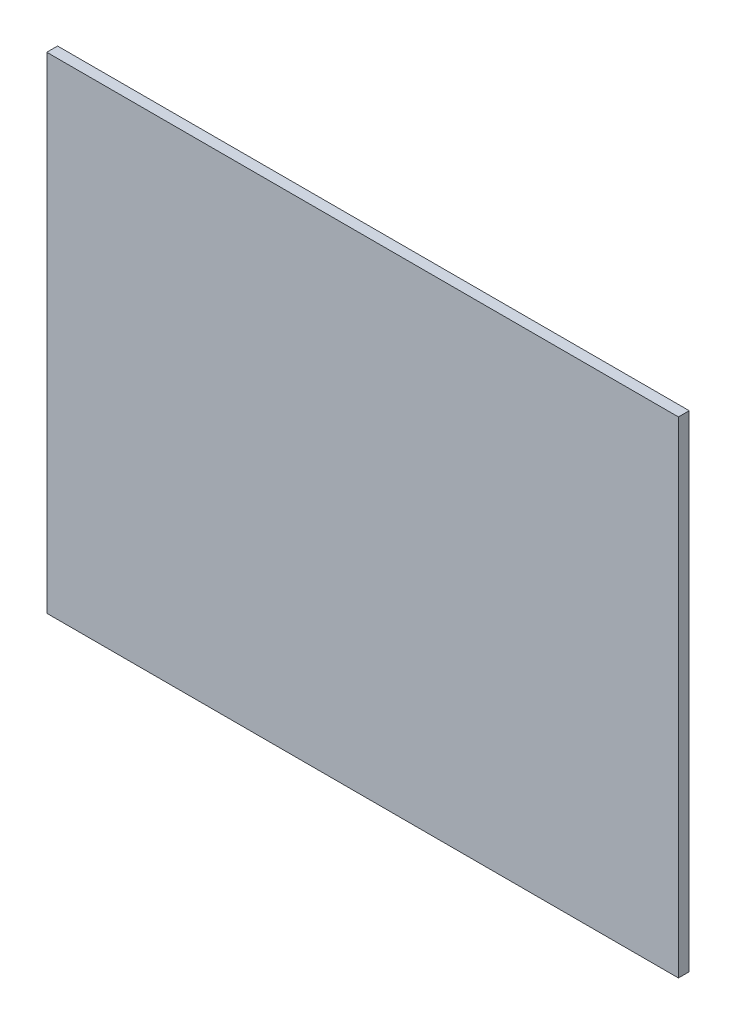
ISO-10303-21;
HEADER;
FILE_DESCRIPTION(('STEP AP214'),'2;1');
FILE_NAME('part.step','',(''),(''),'','','');
FILE_SCHEMA(('AUTOMOTIVE_DESIGN { 1 0 10303 214 1 1 1 1 }'));
ENDSEC;
DATA;
#1=APPLICATION_CONTEXT('core data for automotive mechanical design processes');
#2=APPLICATION_PROTOCOL_DEFINITION('international standard','automotive_design',2000,#1);
#3=PRODUCT_CONTEXT('',#1,'mechanical');
#4=PRODUCT('Part','Part','',(#3));
#5=PRODUCT_RELATED_PRODUCT_CATEGORY('part','',(#4));
#6=PRODUCT_DEFINITION_FORMATION('','',#4);
#7=PRODUCT_DEFINITION_CONTEXT('part definition',#1,'design');
#8=PRODUCT_DEFINITION('design','',#6,#7);
#9=PRODUCT_DEFINITION_SHAPE('','',#8);
#10=(LENGTH_UNIT() NAMED_UNIT(*) SI_UNIT(.MILLI.,.METRE.));
#11=(NAMED_UNIT(*) PLANE_ANGLE_UNIT() SI_UNIT($,.RADIAN.));
#12=(NAMED_UNIT(*) SI_UNIT($,.STERADIAN.) SOLID_ANGLE_UNIT());
#13=UNCERTAINTY_MEASURE_WITH_UNIT(LENGTH_MEASURE(1.E-05),#10,'distance_accuracy_value','');
#14=(GEOMETRIC_REPRESENTATION_CONTEXT(3) GLOBAL_UNCERTAINTY_ASSIGNED_CONTEXT((#13)) GLOBAL_UNIT_ASSIGNED_CONTEXT((#10,
#11,#12)) REPRESENTATION_CONTEXT('',''));
#15=CARTESIAN_POINT('',(0.,0.,0.));
#16=DIRECTION('',(0.,0.,1.));
#17=DIRECTION('',(1.,0.,0.));
#18=AXIS2_PLACEMENT_3D('',#15,#16,#17);
#19=CARTESIAN_POINT('',(0.05,0.132,0.));
#20=DIRECTION('',(0.,0.,1.));
#21=DIRECTION('',(1.,0.,0.));
#22=AXIS2_PLACEMENT_3D('',#19,#20,#21);
#23=PLANE('',#22);
#24=DIRECTION('',(1.,0.,0.));
#25=VECTOR('',#24,1.);
#26=CARTESIAN_POINT('',(2.975,2.382,0.));
#27=LINE('',#26,#25);
#28=CARTESIAN_POINT('',(2.975,2.382,0.));
#29=VERTEX_POINT('',#28);
#30=CARTESIAN_POINT('',(-2.875,2.382,0.));
#31=VERTEX_POINT('',#30);
#32=EDGE_CURVE('E78',#29,#31,#27,.F.);
#33=ORIENTED_EDGE('',*,*,#32,.F.);
#34=DIRECTION('',(0.,1.,0.));
#35=VECTOR('',#34,1.);
#36=CARTESIAN_POINT('',(2.975,-2.118,0.));
#37=LINE('',#36,#35);
#38=CARTESIAN_POINT('',(2.975,-2.118,0.));
#39=VERTEX_POINT('',#38);
#40=EDGE_CURVE('E54',#39,#29,#37,.T.);
#41=ORIENTED_EDGE('',*,*,#40,.F.);
#42=DIRECTION('',(1.,0.,0.));
#43=VECTOR('',#42,1.);
#44=CARTESIAN_POINT('',(-2.875,-2.118,0.));
#45=LINE('',#44,#43);
#46=CARTESIAN_POINT('',(-2.875,-2.118,0.));
#47=VERTEX_POINT('',#46);
#48=EDGE_CURVE('E56',#47,#39,#45,.T.);
#49=ORIENTED_EDGE('',*,*,#48,.F.);
#50=DIRECTION('',(0.,1.,0.));
#51=VECTOR('',#50,1.);
#52=CARTESIAN_POINT('',(-2.875,2.382,0.));
#53=LINE('',#52,#51);
#54=EDGE_CURVE('E19',#31,#47,#53,.F.);
#55=ORIENTED_EDGE('',*,*,#54,.F.);
#56=EDGE_LOOP('',(#33,#41,#49,#55));
#57=FACE_BOUND('',#56,.T.);
#58=ADVANCED_FACE('F16',(#57),#23,.F.);
#59=CARTESIAN_POINT('',(-2.875,2.382,0.));
#60=DIRECTION('',(-1.,0.,0.));
#61=DIRECTION('',(0.,0.,1.));
#62=AXIS2_PLACEMENT_3D('',#59,#60,#61);
#63=PLANE('',#62);
#64=DIRECTION('',(0.,1.,0.));
#65=VECTOR('',#64,1.);
#66=CARTESIAN_POINT('',(-2.875,0.132,0.1));
#67=LINE('',#66,#65);
#68=CARTESIAN_POINT('',(-2.875,2.382,0.1));
#69=VERTEX_POINT('',#68);
#70=CARTESIAN_POINT('',(-2.875,-2.118,0.1));
#71=VERTEX_POINT('',#70);
#72=EDGE_CURVE('E82',#69,#71,#67,.F.);
#73=ORIENTED_EDGE('',*,*,#72,.F.);
#74=DIRECTION('',(0.,0.,1.));
#75=VECTOR('',#74,1.);
#76=CARTESIAN_POINT('',(-2.875,2.382,0.));
#77=LINE('',#76,#75);
#78=EDGE_CURVE('E67',#31,#69,#77,.T.);
#79=ORIENTED_EDGE('',*,*,#78,.F.);
#80=ORIENTED_EDGE('',*,*,#54,.T.);
#81=DIRECTION('',(0.,0.,-1.));
#82=VECTOR('',#81,1.);
#83=CARTESIAN_POINT('',(-2.875,-2.118,0.));
#84=LINE('',#83,#82);
#85=EDGE_CURVE('E62',#71,#47,#84,.T.);
#86=ORIENTED_EDGE('',*,*,#85,.F.);
#87=EDGE_LOOP('',(#73,#79,#80,#86));
#88=FACE_BOUND('',#87,.T.);
#89=ADVANCED_FACE('F64',(#88),#63,.T.);
#90=CARTESIAN_POINT('',(-2.875,-2.118,0.));
#91=DIRECTION('',(0.,-1.,0.));
#92=DIRECTION('',(0.,0.,-1.));
#93=AXIS2_PLACEMENT_3D('',#90,#91,#92);
#94=PLANE('',#93);
#95=DIRECTION('',(1.,0.,0.));
#96=VECTOR('',#95,1.);
#97=CARTESIAN_POINT('',(0.05,-2.118,0.1));
#98=LINE('',#97,#96);
#99=CARTESIAN_POINT('',(2.975,-2.118,0.1));
#100=VERTEX_POINT('',#99);
#101=EDGE_CURVE('E71',#71,#100,#98,.T.);
#102=ORIENTED_EDGE('',*,*,#101,.F.);
#103=ORIENTED_EDGE('',*,*,#85,.T.);
#104=ORIENTED_EDGE('',*,*,#48,.T.);
#105=DIRECTION('',(0.,0.,-1.));
#106=VECTOR('',#105,1.);
#107=CARTESIAN_POINT('',(2.975,-2.118,0.));
#108=LINE('',#107,#106);
#109=EDGE_CURVE('E74',#100,#39,#108,.T.);
#110=ORIENTED_EDGE('',*,*,#109,.F.);
#111=EDGE_LOOP('',(#102,#103,#104,#110));
#112=FACE_BOUND('',#111,.T.);
#113=ADVANCED_FACE('F69',(#112),#94,.T.);
#114=CARTESIAN_POINT('',(2.975,-2.118,0.));
#115=DIRECTION('',(1.,0.,0.));
#116=DIRECTION('',(0.,0.,-1.));
#117=AXIS2_PLACEMENT_3D('',#114,#115,#116);
#118=PLANE('',#117);
#119=DIRECTION('',(0.,1.,0.));
#120=VECTOR('',#119,1.);
#121=CARTESIAN_POINT('',(2.975,0.132,0.1));
#122=LINE('',#121,#120);
#123=CARTESIAN_POINT('',(2.975,2.382,0.1));
#124=VERTEX_POINT('',#123);
#125=EDGE_CURVE('E25',#100,#124,#122,.T.);
#126=ORIENTED_EDGE('',*,*,#125,.F.);
#127=ORIENTED_EDGE('',*,*,#109,.T.);
#128=ORIENTED_EDGE('',*,*,#40,.T.);
#129=DIRECTION('',(0.,0.,1.));
#130=VECTOR('',#129,1.);
#131=CARTESIAN_POINT('',(2.975,2.382,0.));
#132=LINE('',#131,#130);
#133=EDGE_CURVE('E34',#124,#29,#132,.F.);
#134=ORIENTED_EDGE('',*,*,#133,.F.);
#135=EDGE_LOOP('',(#126,#127,#128,#134));
#136=FACE_BOUND('',#135,.T.);
#137=ADVANCED_FACE('F88',(#136),#118,.T.);
#138=CARTESIAN_POINT('',(2.975,2.382,0.));
#139=DIRECTION('',(0.,1.,0.));
#140=DIRECTION('',(0.,0.,1.));
#141=AXIS2_PLACEMENT_3D('',#138,#139,#140);
#142=PLANE('',#141);
#143=DIRECTION('',(1.,0.,0.));
#144=VECTOR('',#143,1.);
#145=CARTESIAN_POINT('',(0.05,2.382,0.1));
#146=LINE('',#145,#144);
#147=EDGE_CURVE('E11',#124,#69,#146,.F.);
#148=ORIENTED_EDGE('',*,*,#147,.F.);
#149=ORIENTED_EDGE('',*,*,#133,.T.);
#150=ORIENTED_EDGE('',*,*,#32,.T.);
#151=ORIENTED_EDGE('',*,*,#78,.T.);
#152=EDGE_LOOP('',(#148,#149,#150,#151));
#153=FACE_BOUND('',#152,.T.);
#154=ADVANCED_FACE('F90',(#153),#142,.T.);
#155=CARTESIAN_POINT('',(0.05,0.132,0.1));
#156=DIRECTION('',(0.,0.,1.));
#157=DIRECTION('',(1.,0.,0.));
#158=AXIS2_PLACEMENT_3D('',#155,#156,#157);
#159=PLANE('',#158);
#160=ORIENTED_EDGE('',*,*,#125,.T.);
#161=ORIENTED_EDGE('',*,*,#147,.T.);
#162=ORIENTED_EDGE('',*,*,#72,.T.);
#163=ORIENTED_EDGE('',*,*,#101,.T.);
#164=EDGE_LOOP('',(#160,#161,#162,#163));
#165=FACE_BOUND('',#164,.T.);
#166=ADVANCED_FACE('F87',(#165),#159,.T.);
#167=CLOSED_SHELL('',(#58,#89,#113,#137,#154,#166));
#168=MANIFOLD_SOLID_BREP('B1',#167);
#169=ADVANCED_BREP_SHAPE_REPRESENTATION('',(#18,#168),#14);
#170=SHAPE_DEFINITION_REPRESENTATION(#9,#169);
ENDSEC;
END-ISO-10303-21;
